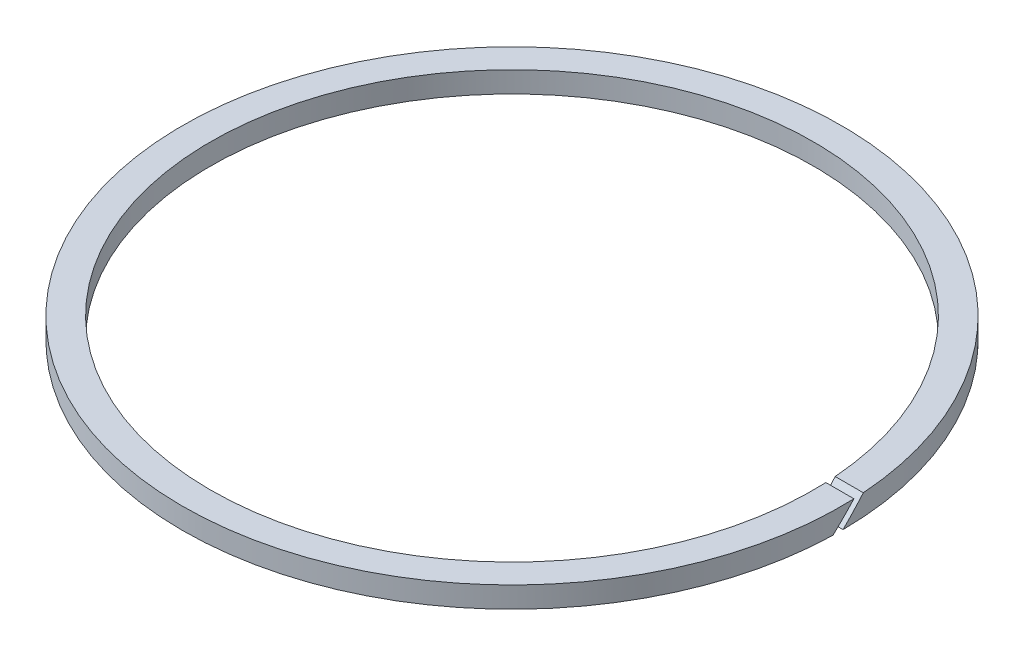
ISO-10303-21;
HEADER;
FILE_DESCRIPTION(('STEP AP214'),'2;1');
FILE_NAME('part.step','',(''),(''),'','','');
FILE_SCHEMA(('AUTOMOTIVE_DESIGN { 1 0 10303 214 1 1 1 1 }'));
ENDSEC;
DATA;
#1=APPLICATION_CONTEXT('core data for automotive mechanical design processes');
#2=APPLICATION_PROTOCOL_DEFINITION('international standard','automotive_design',2000,#1);
#3=PRODUCT_CONTEXT('',#1,'mechanical');
#4=PRODUCT('Part','Part','',(#3));
#5=PRODUCT_RELATED_PRODUCT_CATEGORY('part','',(#4));
#6=PRODUCT_DEFINITION_FORMATION('','',#4);
#7=PRODUCT_DEFINITION_CONTEXT('part definition',#1,'design');
#8=PRODUCT_DEFINITION('design','',#6,#7);
#9=PRODUCT_DEFINITION_SHAPE('','',#8);
#10=(LENGTH_UNIT() NAMED_UNIT(*) SI_UNIT(.MILLI.,.METRE.));
#11=(NAMED_UNIT(*) PLANE_ANGLE_UNIT() SI_UNIT($,.RADIAN.));
#12=(NAMED_UNIT(*) SI_UNIT($,.STERADIAN.) SOLID_ANGLE_UNIT());
#13=UNCERTAINTY_MEASURE_WITH_UNIT(LENGTH_MEASURE(1.E-05),#10,'distance_accuracy_value','');
#14=(GEOMETRIC_REPRESENTATION_CONTEXT(3) GLOBAL_UNCERTAINTY_ASSIGNED_CONTEXT((#13)) GLOBAL_UNIT_ASSIGNED_CONTEXT((#10,
#11,#12)) REPRESENTATION_CONTEXT('',''));
#15=CARTESIAN_POINT('',(0.,0.,0.));
#16=DIRECTION('',(0.,0.,1.));
#17=DIRECTION('',(1.,0.,0.));
#18=AXIS2_PLACEMENT_3D('',#15,#16,#17);
#19=CARTESIAN_POINT('',(0.,1.5,0.));
#20=DIRECTION('',(0.,1.,0.));
#21=DIRECTION('',(0.,0.,1.));
#22=AXIS2_PLACEMENT_3D('',#19,#20,#21);
#23=PLANE('',#22);
#24=CARTESIAN_POINT('',(0.,1.5,0.));
#25=DIRECTION('',(0.,1.,0.));
#26=DIRECTION('',(0.,0.,1.));
#27=AXIS2_PLACEMENT_3D('',#24,#25,#26);
#28=CIRCLE('',#27,47.);
#29=CARTESIAN_POINT('',(46.8904517582638,1.5,-3.20710678118654));
#30=VERTEX_POINT('',#29);
#31=CARTESIAN_POINT('',(46.965791102737,1.5,-1.79289321881345));
#32=VERTEX_POINT('',#31);
#33=EDGE_CURVE('E82',#30,#32,#28,.T.);
#34=ORIENTED_EDGE('',*,*,#33,.T.);
#35=DIRECTION('',(-1.,0.,0.));
#36=VECTOR('',#35,1.);
#37=CARTESIAN_POINT('',(0.,1.5,-1.79289321881345));
#38=LINE('',#37,#36);
#39=CARTESIAN_POINT('',(42.9626062280436,1.5,-1.79289321881345));
#40=VERTEX_POINT('',#39);
#41=EDGE_CURVE('E96',#32,#40,#38,.T.);
#42=ORIENTED_EDGE('',*,*,#41,.T.);
#43=CARTESIAN_POINT('',(0.,1.5,0.));
#44=DIRECTION('',(0.,1.,0.));
#45=DIRECTION('',(0.,0.,1.));
#46=AXIS2_PLACEMENT_3D('',#43,#44,#45);
#47=CIRCLE('',#46,43.);
#48=CARTESIAN_POINT('',(42.8802339790033,1.5,-3.20710678118654));
#49=VERTEX_POINT('',#48);
#50=EDGE_CURVE('E92',#49,#40,#47,.T.);
#51=ORIENTED_EDGE('',*,*,#50,.F.);
#52=DIRECTION('',(1.,0.,0.));
#53=VECTOR('',#52,1.);
#54=CARTESIAN_POINT('',(0.,1.5,-3.20710678118654));
#55=LINE('',#54,#53);
#56=EDGE_CURVE('E59',#49,#30,#55,.T.);
#57=ORIENTED_EDGE('',*,*,#56,.T.);
#58=EDGE_LOOP('',(#34,#42,#51,#57));
#59=FACE_BOUND('',#58,.T.);
#60=ADVANCED_FACE('F37',(#59),#23,.T.);
#61=CARTESIAN_POINT('',(0.,-1.5,0.));
#62=DIRECTION('',(0.,1.,0.));
#63=DIRECTION('',(0.,0.,1.));
#64=AXIS2_PLACEMENT_3D('',#61,#62,#63);
#65=PLANE('',#64);
#66=DIRECTION('',(-1.,0.,0.));
#67=VECTOR('',#66,1.);
#68=CARTESIAN_POINT('',(0.,-1.5,1.20710678118654));
#69=LINE('',#68,#67);
#70=CARTESIAN_POINT('',(46.9844963069608,-1.5,1.20710678118654));
#71=VERTEX_POINT('',#70);
#72=CARTESIAN_POINT('',(42.983053558569,-1.5,1.20710678118654));
#73=VERTEX_POINT('',#72);
#74=EDGE_CURVE('E52',#71,#73,#69,.T.);
#75=ORIENTED_EDGE('',*,*,#74,.F.);
#76=CARTESIAN_POINT('',(0.,-1.5,0.));
#77=DIRECTION('',(0.,1.,0.));
#78=DIRECTION('',(0.,0.,1.));
#79=AXIS2_PLACEMENT_3D('',#76,#77,#78);
#80=CIRCLE('',#79,47.);
#81=CARTESIAN_POINT('',(46.9995436869464,-1.5,-0.207106781186553));
#82=VERTEX_POINT('',#81);
#83=EDGE_CURVE('E89',#82,#71,#80,.T.);
#84=ORIENTED_EDGE('',*,*,#83,.F.);
#85=DIRECTION('',(1.,0.,0.));
#86=VECTOR('',#85,1.);
#87=CARTESIAN_POINT('',(0.,-1.5,-0.207106781186553));
#88=LINE('',#87,#86);
#89=CARTESIAN_POINT('',(42.9995012387491,-1.5,-0.207106781186553));
#90=VERTEX_POINT('',#89);
#91=EDGE_CURVE('E76',#90,#82,#88,.T.);
#92=ORIENTED_EDGE('',*,*,#91,.F.);
#93=CARTESIAN_POINT('',(0.,-1.5,0.));
#94=DIRECTION('',(0.,1.,0.));
#95=DIRECTION('',(0.,0.,1.));
#96=AXIS2_PLACEMENT_3D('',#93,#94,#95);
#97=CIRCLE('',#96,43.);
#98=EDGE_CURVE('E87',#90,#73,#97,.T.);
#99=ORIENTED_EDGE('',*,*,#98,.T.);
#100=EDGE_LOOP('',(#75,#84,#92,#99));
#101=FACE_BOUND('',#100,.T.);
#102=ADVANCED_FACE('F86',(#101),#65,.F.);
#103=CARTESIAN_POINT('',(0.,1.5,0.));
#104=DIRECTION('',(0.,-1.,0.));
#105=DIRECTION('',(0.,0.,-1.));
#106=AXIS2_PLACEMENT_3D('',#103,#104,#105);
#107=CYLINDRICAL_SURFACE('',#106,47.);
#108=CARTESIAN_POINT('',(0.,-0.292893218813456,0.));
#109=DIRECTION('',(0.,-0.707106781186546,-0.707106781186549));
#110=DIRECTION('',(0.,-0.707106781186549,0.707106781186546));
#111=AXIS2_PLACEMENT_3D('',#108,#109,#110);
#112=ELLIPSE('',#111,66.4680374315356,47.);
#113=EDGE_CURVE('E93',#32,#71,#112,.T.);
#114=ORIENTED_EDGE('',*,*,#113,.F.);
#115=ORIENTED_EDGE('',*,*,#33,.F.);
#116=CARTESIAN_POINT('',(0.,-1.70710678118655,0.));
#117=DIRECTION('',(0.,0.707106781186546,0.707106781186549));
#118=DIRECTION('',(0.,-0.707106781186549,0.707106781186546));
#119=AXIS2_PLACEMENT_3D('',#116,#117,#118);
#120=ELLIPSE('',#119,66.4680374315356,47.);
#121=EDGE_CURVE('E104',#82,#30,#120,.T.);
#122=ORIENTED_EDGE('',*,*,#121,.F.);
#123=ORIENTED_EDGE('',*,*,#83,.T.);
#124=EDGE_LOOP('',(#114,#115,#122,#123));
#125=FACE_BOUND('',#124,.T.);
#126=ADVANCED_FACE('F39',(#125),#107,.T.);
#127=CARTESIAN_POINT('',(0.,1.5,0.));
#128=DIRECTION('',(0.,-1.,0.));
#129=DIRECTION('',(0.,0.,-1.));
#130=AXIS2_PLACEMENT_3D('',#127,#128,#129);
#131=CYLINDRICAL_SURFACE('',#130,43.);
#132=ORIENTED_EDGE('',*,*,#50,.T.);
#133=CARTESIAN_POINT('',(0.,-0.292893218813456,0.));
#134=DIRECTION('',(0.,-0.707106781186546,-0.707106781186549));
#135=DIRECTION('',(0.,-0.707106781186549,0.707106781186546));
#136=AXIS2_PLACEMENT_3D('',#133,#134,#135);
#137=ELLIPSE('',#136,60.8111831820432,43.);
#138=EDGE_CURVE('E11',#40,#73,#137,.T.);
#139=ORIENTED_EDGE('',*,*,#138,.T.);
#140=ORIENTED_EDGE('',*,*,#98,.F.);
#141=CARTESIAN_POINT('',(0.,-1.70710678118655,0.));
#142=DIRECTION('',(0.,0.707106781186546,0.707106781186549));
#143=DIRECTION('',(0.,-0.707106781186549,0.707106781186546));
#144=AXIS2_PLACEMENT_3D('',#141,#142,#143);
#145=ELLIPSE('',#144,60.8111831820432,43.);
#146=EDGE_CURVE('E45',#90,#49,#145,.T.);
#147=ORIENTED_EDGE('',*,*,#146,.T.);
#148=EDGE_LOOP('',(#132,#139,#140,#147));
#149=FACE_BOUND('',#148,.T.);
#150=ADVANCED_FACE('F91',(#149),#131,.F.);
#151=CARTESIAN_POINT('',(47.,3.49969547276168,-5.20680225394821));
#152=DIRECTION('',(0.,0.707106781186546,0.707106781186549));
#153=DIRECTION('',(0.,-0.707106781186549,0.707106781186546));
#154=AXIS2_PLACEMENT_3D('',#151,#152,#153);
#155=PLANE('',#154);
#156=ORIENTED_EDGE('',*,*,#121,.T.);
#157=ORIENTED_EDGE('',*,*,#56,.F.);
#158=ORIENTED_EDGE('',*,*,#146,.F.);
#159=ORIENTED_EDGE('',*,*,#91,.T.);
#160=EDGE_LOOP('',(#156,#157,#158,#159));
#161=FACE_BOUND('',#160,.T.);
#162=ADVANCED_FACE('F75',(#161),#155,.T.);
#163=CARTESIAN_POINT('',(47.,4.20680225394823,-4.49969547276166));
#164=DIRECTION('',(0.,-0.707106781186546,-0.707106781186549));
#165=DIRECTION('',(0.,0.707106781186549,-0.707106781186546));
#166=AXIS2_PLACEMENT_3D('',#163,#164,#165);
#167=PLANE('',#166);
#168=ORIENTED_EDGE('',*,*,#113,.T.);
#169=ORIENTED_EDGE('',*,*,#74,.T.);
#170=ORIENTED_EDGE('',*,*,#138,.F.);
#171=ORIENTED_EDGE('',*,*,#41,.F.);
#172=EDGE_LOOP('',(#168,#169,#170,#171));
#173=FACE_BOUND('',#172,.T.);
#174=ADVANCED_FACE('F111',(#173),#167,.T.);
#175=CLOSED_SHELL('',(#60,#102,#126,#150,#162,#174));
#176=MANIFOLD_SOLID_BREP('B2',#175);
#177=ADVANCED_BREP_SHAPE_REPRESENTATION('',(#18,#176),#14);
#178=SHAPE_DEFINITION_REPRESENTATION(#9,#177);
ENDSEC;
END-ISO-10303-21;
